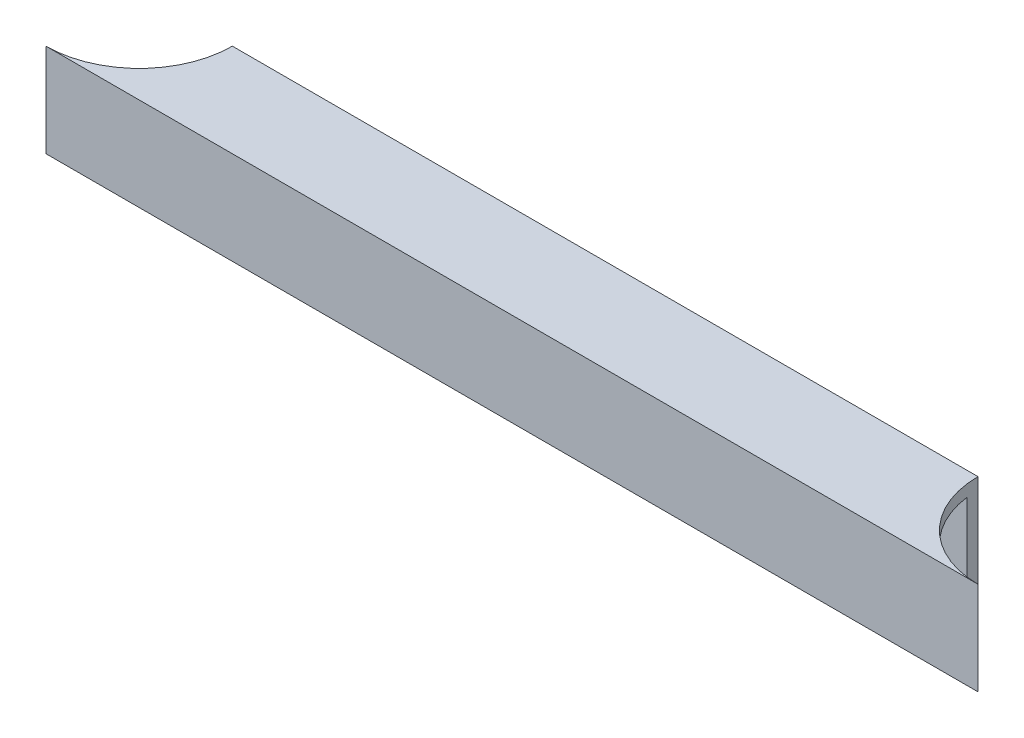
ISO-10303-21;
HEADER;
FILE_DESCRIPTION(('STEP AP214'),'2;1');
FILE_NAME('part.step','',(''),(''),'','','');
FILE_SCHEMA(('AUTOMOTIVE_DESIGN { 1 0 10303 214 1 1 1 1 }'));
ENDSEC;
DATA;
#1=APPLICATION_CONTEXT('core data for automotive mechanical design processes');
#2=APPLICATION_PROTOCOL_DEFINITION('international standard','automotive_design',2000,#1);
#3=PRODUCT_CONTEXT('',#1,'mechanical');
#4=PRODUCT('Part','Part','',(#3));
#5=PRODUCT_RELATED_PRODUCT_CATEGORY('part','',(#4));
#6=PRODUCT_DEFINITION_FORMATION('','',#4);
#7=PRODUCT_DEFINITION_CONTEXT('part definition',#1,'design');
#8=PRODUCT_DEFINITION('design','',#6,#7);
#9=PRODUCT_DEFINITION_SHAPE('','',#8);
#10=(LENGTH_UNIT() NAMED_UNIT(*) SI_UNIT(.MILLI.,.METRE.));
#11=(NAMED_UNIT(*) PLANE_ANGLE_UNIT() SI_UNIT($,.RADIAN.));
#12=(NAMED_UNIT(*) SI_UNIT($,.STERADIAN.) SOLID_ANGLE_UNIT());
#13=UNCERTAINTY_MEASURE_WITH_UNIT(LENGTH_MEASURE(1.E-05),#10,'distance_accuracy_value','');
#14=(GEOMETRIC_REPRESENTATION_CONTEXT(3) GLOBAL_UNCERTAINTY_ASSIGNED_CONTEXT((#13)) GLOBAL_UNIT_ASSIGNED_CONTEXT((#10,
#11,#12)) REPRESENTATION_CONTEXT('',''));
#15=CARTESIAN_POINT('',(0.,0.,0.));
#16=DIRECTION('',(0.,0.,1.));
#17=DIRECTION('',(1.,0.,0.));
#18=AXIS2_PLACEMENT_3D('',#15,#16,#17);
#19=CARTESIAN_POINT('',(0.,25.4,98.7234841870858));
#20=DIRECTION('',(0.,0.,-1.00000000000002));
#21=DIRECTION('',(-1.00000000000002,0.,0.));
#22=AXIS2_PLACEMENT_3D('',#19,#20,#21);
#23=PLANE('',#22);
#24=DIRECTION('',(1.00000000000002,0.,0.));
#25=VECTOR('',#24,1.);
#26=CARTESIAN_POINT('',(0.,0.,98.7234841870858));
#27=LINE('',#26,#25);
#28=CARTESIAN_POINT('',(-127.000000000004,0.,98.7234841870858));
#29=VERTEX_POINT('',#28);
#30=CARTESIAN_POINT('',(127.000000000003,0.,98.7234841870861));
#31=VERTEX_POINT('',#30);
#32=EDGE_CURVE('E136',#29,#31,#27,.T.);
#33=ORIENTED_EDGE('',*,*,#32,.T.);
#34=DIRECTION('',(0.,-1.,0.));
#35=VECTOR('',#34,1.);
#36=CARTESIAN_POINT('',(127.000000000003,25.4,98.7234841870861));
#37=LINE('',#36,#35);
#38=CARTESIAN_POINT('',(127.000000000003,25.4,98.7234841870861));
#39=VERTEX_POINT('',#38);
#40=EDGE_CURVE('E175',#39,#31,#37,.T.);
#41=ORIENTED_EDGE('',*,*,#40,.F.);
#42=DIRECTION('',(1.00000000000002,0.,0.));
#43=VECTOR('',#42,1.);
#44=CARTESIAN_POINT('',(0.,25.4,98.7234841870858));
#45=LINE('',#44,#43);
#46=CARTESIAN_POINT('',(-127.000000000004,25.4,98.7234841870858));
#47=VERTEX_POINT('',#46);
#48=EDGE_CURVE('E137',#47,#39,#45,.T.);
#49=ORIENTED_EDGE('',*,*,#48,.F.);
#50=DIRECTION('',(0.,-1.,0.));
#51=VECTOR('',#50,1.);
#52=CARTESIAN_POINT('',(-127.000000000004,25.4,98.7234841870858));
#53=LINE('',#52,#51);
#54=EDGE_CURVE('E152',#47,#29,#53,.T.);
#55=ORIENTED_EDGE('',*,*,#54,.T.);
#56=EDGE_LOOP('',(#33,#41,#49,#55));
#57=FACE_BOUND('',#56,.T.);
#58=ADVANCED_FACE('F42',(#57),#23,.F.);
#59=CARTESIAN_POINT('',(127.000000000003,25.4,73.323484187085));
#60=DIRECTION('',(0.,-1.,0.));
#61=DIRECTION('',(0.,0.,-1.00000000000002));
#62=AXIS2_PLACEMENT_3D('',#59,#60,#61);
#63=CYLINDRICAL_SURFACE('',#62,25.4);
#64=CARTESIAN_POINT('',(127.000000000003,3.17499999999998,73.323484187085));
#65=DIRECTION('',(0.,-1.,0.));
#66=DIRECTION('',(0.,0.,-1.00000000000002));
#67=AXIS2_PLACEMENT_3D('',#64,#65,#66);
#68=CIRCLE('',#67,25.4);
#69=CARTESIAN_POINT('',(101.799218762112,3.17499999999998,76.4984841870852));
#70=VERTEX_POINT('',#69);
#71=CARTESIAN_POINT('',(114.703277875794,3.17499999999998,95.5484841870858));
#72=VERTEX_POINT('',#71);
#73=EDGE_CURVE('E103',#70,#72,#68,.F.);
#74=ORIENTED_EDGE('',*,*,#73,.T.);
#75=DIRECTION('',(0.,-1.,0.));
#76=VECTOR('',#75,1.);
#77=CARTESIAN_POINT('',(114.703277875794,25.4,95.5484841870858));
#78=LINE('',#77,#76);
#79=CARTESIAN_POINT('',(114.703277875794,22.225,95.5484841870858));
#80=VERTEX_POINT('',#79);
#81=EDGE_CURVE('E130',#72,#80,#78,.F.);
#82=ORIENTED_EDGE('',*,*,#81,.T.);
#83=CARTESIAN_POINT('',(127.000000000003,22.225,73.323484187085));
#84=DIRECTION('',(0.,1.,0.));
#85=DIRECTION('',(0.,0.,1.00000000000002));
#86=AXIS2_PLACEMENT_3D('',#83,#84,#85);
#87=CIRCLE('',#86,25.4);
#88=CARTESIAN_POINT('',(101.799218762112,22.225,76.4984841870852));
#89=VERTEX_POINT('',#88);
#90=EDGE_CURVE('E125',#80,#89,#87,.F.);
#91=ORIENTED_EDGE('',*,*,#90,.T.);
#92=DIRECTION('',(0.,-1.,0.));
#93=VECTOR('',#92,1.);
#94=CARTESIAN_POINT('',(101.799218762112,25.4,76.4984841870852));
#95=LINE('',#94,#93);
#96=EDGE_CURVE('E109',#89,#70,#95,.T.);
#97=ORIENTED_EDGE('',*,*,#96,.T.);
#98=EDGE_LOOP('',(#74,#82,#91,#97));
#99=FACE_BOUND('',#98,.T.);
#100=CARTESIAN_POINT('',(127.000000000003,0.,73.323484187085));
#101=DIRECTION('',(0.,1.,0.));
#102=DIRECTION('',(0.,0.,1.00000000000002));
#103=AXIS2_PLACEMENT_3D('',#100,#101,#102);
#104=CIRCLE('',#103,25.4);
#105=CARTESIAN_POINT('',(101.600000000003,0.,73.3234841870851));
#106=VERTEX_POINT('',#105);
#107=EDGE_CURVE('E156',#31,#106,#104,.F.);
#108=ORIENTED_EDGE('',*,*,#107,.T.);
#109=DIRECTION('',(0.,-1.,0.));
#110=VECTOR('',#109,1.);
#111=CARTESIAN_POINT('',(101.600000000003,25.4,73.3234841870851));
#112=LINE('',#111,#110);
#113=CARTESIAN_POINT('',(101.600000000003,25.4,73.3234841870851));
#114=VERTEX_POINT('',#113);
#115=EDGE_CURVE('E171',#114,#106,#112,.T.);
#116=ORIENTED_EDGE('',*,*,#115,.F.);
#117=CARTESIAN_POINT('',(127.000000000003,25.4,73.323484187085));
#118=DIRECTION('',(0.,1.,0.));
#119=DIRECTION('',(0.,0.,1.00000000000002));
#120=AXIS2_PLACEMENT_3D('',#117,#118,#119);
#121=CIRCLE('',#120,25.4);
#122=EDGE_CURVE('E141',#39,#114,#121,.F.);
#123=ORIENTED_EDGE('',*,*,#122,.F.);
#124=ORIENTED_EDGE('',*,*,#40,.T.);
#125=EDGE_LOOP('',(#108,#116,#123,#124));
#126=FACE_BOUND('',#125,.T.);
#127=ADVANCED_FACE('F123',(#99,#126),#63,.F.);
#128=CARTESIAN_POINT('',(0.,25.4,73.3234841870848));
#129=DIRECTION('',(0.,0.,1.00000000000003));
#130=DIRECTION('',(1.00000000000003,0.,0.));
#131=AXIS2_PLACEMENT_3D('',#128,#129,#130);
#132=PLANE('',#131);
#133=DIRECTION('',(-1.00000000000003,0.,0.));
#134=VECTOR('',#133,1.);
#135=CARTESIAN_POINT('',(0.,0.,73.3234841870848));
#136=LINE('',#135,#134);
#137=CARTESIAN_POINT('',(-101.600000000003,0.,73.3234841870848));
#138=VERTEX_POINT('',#137);
#139=EDGE_CURVE('E159',#106,#138,#136,.T.);
#140=ORIENTED_EDGE('',*,*,#139,.T.);
#141=DIRECTION('',(0.,-1.,0.));
#142=VECTOR('',#141,1.);
#143=CARTESIAN_POINT('',(-101.600000000003,25.4,73.3234841870848));
#144=LINE('',#143,#142);
#145=CARTESIAN_POINT('',(-101.600000000003,25.4,73.3234841870848));
#146=VERTEX_POINT('',#145);
#147=EDGE_CURVE('E168',#146,#138,#144,.T.);
#148=ORIENTED_EDGE('',*,*,#147,.F.);
#149=DIRECTION('',(-1.00000000000003,0.,0.));
#150=VECTOR('',#149,1.);
#151=CARTESIAN_POINT('',(0.,25.4,73.3234841870848));
#152=LINE('',#151,#150);
#153=EDGE_CURVE('E145',#114,#146,#152,.T.);
#154=ORIENTED_EDGE('',*,*,#153,.F.);
#155=ORIENTED_EDGE('',*,*,#115,.T.);
#156=EDGE_LOOP('',(#140,#148,#154,#155));
#157=FACE_BOUND('',#156,.T.);
#158=ADVANCED_FACE('F224',(#157),#132,.F.);
#159=CARTESIAN_POINT('',(-127.000000000003,25.4,73.3234841870851));
#160=DIRECTION('',(0.,-1.,0.));
#161=DIRECTION('',(0.,0.,-1.00000000000002));
#162=AXIS2_PLACEMENT_3D('',#159,#160,#161);
#163=CYLINDRICAL_SURFACE('',#162,25.4);
#164=DIRECTION('',(0.,-1.,0.));
#165=VECTOR('',#164,1.);
#166=CARTESIAN_POINT('',(-114.703277875795,25.4,95.5484841870862));
#167=LINE('',#166,#165);
#168=CARTESIAN_POINT('',(-114.703277875795,3.17499999999998,95.5484841870862));
#169=VERTEX_POINT('',#168);
#170=CARTESIAN_POINT('',(-114.703277875795,22.225,95.5484841870862));
#171=VERTEX_POINT('',#170);
#172=EDGE_CURVE('E11',#169,#171,#167,.F.);
#173=ORIENTED_EDGE('',*,*,#172,.F.);
#174=CARTESIAN_POINT('',(-127.000000000003,3.17499999999998,73.3234841870851));
#175=DIRECTION('',(0.,-1.,0.));
#176=DIRECTION('',(0.,0.,-1.00000000000002));
#177=AXIS2_PLACEMENT_3D('',#174,#175,#176);
#178=CIRCLE('',#177,25.4);
#179=CARTESIAN_POINT('',(-101.799218762113,3.17499999999998,76.4984841870849));
#180=VERTEX_POINT('',#179);
#181=EDGE_CURVE('E179',#180,#169,#178,.T.);
#182=ORIENTED_EDGE('',*,*,#181,.F.);
#183=DIRECTION('',(0.,-1.,0.));
#184=VECTOR('',#183,1.);
#185=CARTESIAN_POINT('',(-101.799218762113,25.4,76.4984841870849));
#186=LINE('',#185,#184);
#187=CARTESIAN_POINT('',(-101.799218762113,22.225,76.4984841870849));
#188=VERTEX_POINT('',#187);
#189=EDGE_CURVE('E117',#188,#180,#186,.T.);
#190=ORIENTED_EDGE('',*,*,#189,.F.);
#191=CARTESIAN_POINT('',(-127.000000000003,22.225,73.3234841870851));
#192=DIRECTION('',(0.,1.,0.));
#193=DIRECTION('',(0.,0.,1.00000000000002));
#194=AXIS2_PLACEMENT_3D('',#191,#192,#193);
#195=CIRCLE('',#194,25.4);
#196=EDGE_CURVE('E50',#171,#188,#195,.T.);
#197=ORIENTED_EDGE('',*,*,#196,.F.);
#198=EDGE_LOOP('',(#173,#182,#190,#197));
#199=FACE_BOUND('',#198,.T.);
#200=CARTESIAN_POINT('',(-127.000000000003,0.,73.3234841870851));
#201=DIRECTION('',(0.,1.,0.));
#202=DIRECTION('',(0.,0.,1.00000000000002));
#203=AXIS2_PLACEMENT_3D('',#200,#201,#202);
#204=CIRCLE('',#203,25.4);
#205=EDGE_CURVE('E142',#29,#138,#204,.T.);
#206=ORIENTED_EDGE('',*,*,#205,.F.);
#207=ORIENTED_EDGE('',*,*,#54,.F.);
#208=CARTESIAN_POINT('',(-127.000000000003,25.4,73.3234841870851));
#209=DIRECTION('',(0.,1.,0.));
#210=DIRECTION('',(0.,0.,1.00000000000002));
#211=AXIS2_PLACEMENT_3D('',#208,#209,#210);
#212=CIRCLE('',#211,25.4);
#213=EDGE_CURVE('E148',#47,#146,#212,.T.);
#214=ORIENTED_EDGE('',*,*,#213,.T.);
#215=ORIENTED_EDGE('',*,*,#147,.T.);
#216=EDGE_LOOP('',(#206,#207,#214,#215));
#217=FACE_BOUND('',#216,.T.);
#218=ADVANCED_FACE('F194',(#199,#217),#163,.F.);
#219=CARTESIAN_POINT('',(0.,25.4,0.));
#220=DIRECTION('',(0.,1.,0.));
#221=DIRECTION('',(0.,0.,1.00000000000002));
#222=AXIS2_PLACEMENT_3D('',#219,#220,#221);
#223=PLANE('',#222);
#224=ORIENTED_EDGE('',*,*,#48,.T.);
#225=ORIENTED_EDGE('',*,*,#122,.T.);
#226=ORIENTED_EDGE('',*,*,#153,.T.);
#227=ORIENTED_EDGE('',*,*,#213,.F.);
#228=EDGE_LOOP('',(#224,#225,#226,#227));
#229=FACE_BOUND('',#228,.T.);
#230=ADVANCED_FACE('F214',(#229),#223,.T.);
#231=CARTESIAN_POINT('',(0.,0.,0.));
#232=DIRECTION('',(0.,1.,0.));
#233=DIRECTION('',(0.,0.,1.00000000000002));
#234=AXIS2_PLACEMENT_3D('',#231,#232,#233);
#235=PLANE('',#234);
#236=ORIENTED_EDGE('',*,*,#32,.F.);
#237=ORIENTED_EDGE('',*,*,#205,.T.);
#238=ORIENTED_EDGE('',*,*,#139,.F.);
#239=ORIENTED_EDGE('',*,*,#107,.F.);
#240=EDGE_LOOP('',(#236,#237,#238,#239));
#241=FACE_BOUND('',#240,.T.);
#242=ADVANCED_FACE('F207',(#241),#235,.F.);
#243=CARTESIAN_POINT('',(-127.000000000004,22.225,95.548484187086));
#244=DIRECTION('',(0.,0.,1.00000000000002));
#245=DIRECTION('',(1.00000000000002,0.,0.));
#246=AXIS2_PLACEMENT_3D('',#243,#244,#245);
#247=PLANE('',#246);
#248=DIRECTION('',(1.00000000000002,0.,0.));
#249=VECTOR('',#248,1.);
#250=CARTESIAN_POINT('',(-127.000000000004,3.17499999999998,95.548484187086));
#251=LINE('',#250,#249);
#252=EDGE_CURVE('E57',#169,#72,#251,.T.);
#253=ORIENTED_EDGE('',*,*,#252,.F.);
#254=ORIENTED_EDGE('',*,*,#172,.T.);
#255=DIRECTION('',(1.00000000000002,0.,0.));
#256=VECTOR('',#255,1.);
#257=CARTESIAN_POINT('',(-127.000000000004,22.225,95.548484187086));
#258=LINE('',#257,#256);
#259=EDGE_CURVE('E110',#171,#80,#258,.T.);
#260=ORIENTED_EDGE('',*,*,#259,.T.);
#261=ORIENTED_EDGE('',*,*,#81,.F.);
#262=EDGE_LOOP('',(#253,#254,#260,#261));
#263=FACE_BOUND('',#262,.T.);
#264=ADVANCED_FACE('F197',(#263),#247,.F.);
#265=CARTESIAN_POINT('',(-127.000000000004,22.225,95.548484187086));
#266=DIRECTION('',(0.,1.,0.));
#267=DIRECTION('',(0.,0.,1.00000000000002));
#268=AXIS2_PLACEMENT_3D('',#265,#266,#267);
#269=PLANE('',#268);
#270=ORIENTED_EDGE('',*,*,#259,.F.);
#271=ORIENTED_EDGE('',*,*,#196,.T.);
#272=DIRECTION('',(1.00000000000002,0.,0.));
#273=VECTOR('',#272,1.);
#274=CARTESIAN_POINT('',(-127.000000000003,22.225,76.4984841870857));
#275=LINE('',#274,#273);
#276=EDGE_CURVE('E120',#188,#89,#275,.T.);
#277=ORIENTED_EDGE('',*,*,#276,.T.);
#278=ORIENTED_EDGE('',*,*,#90,.F.);
#279=EDGE_LOOP('',(#270,#271,#277,#278));
#280=FACE_BOUND('',#279,.T.);
#281=ADVANCED_FACE('F188',(#280),#269,.F.);
#282=CARTESIAN_POINT('',(-127.000000000003,22.225,76.4984841870857));
#283=DIRECTION('',(0.,0.,-1.00000000000002));
#284=DIRECTION('',(-1.00000000000002,0.,0.));
#285=AXIS2_PLACEMENT_3D('',#282,#283,#284);
#286=PLANE('',#285);
#287=ORIENTED_EDGE('',*,*,#276,.F.);
#288=ORIENTED_EDGE('',*,*,#189,.T.);
#289=DIRECTION('',(1.00000000000002,0.,0.));
#290=VECTOR('',#289,1.);
#291=CARTESIAN_POINT('',(-127.000000000003,3.17499999999998,76.4984841870857));
#292=LINE('',#291,#290);
#293=EDGE_CURVE('E62',#180,#70,#292,.T.);
#294=ORIENTED_EDGE('',*,*,#293,.T.);
#295=ORIENTED_EDGE('',*,*,#96,.F.);
#296=EDGE_LOOP('',(#287,#288,#294,#295));
#297=FACE_BOUND('',#296,.T.);
#298=ADVANCED_FACE('F114',(#297),#286,.F.);
#299=CARTESIAN_POINT('',(-127.000000000004,3.17499999999998,95.548484187086));
#300=DIRECTION('',(0.,-1.,0.));
#301=DIRECTION('',(0.,0.,-1.00000000000002));
#302=AXIS2_PLACEMENT_3D('',#299,#300,#301);
#303=PLANE('',#302);
#304=ORIENTED_EDGE('',*,*,#293,.F.);
#305=ORIENTED_EDGE('',*,*,#181,.T.);
#306=ORIENTED_EDGE('',*,*,#252,.T.);
#307=ORIENTED_EDGE('',*,*,#73,.F.);
#308=EDGE_LOOP('',(#304,#305,#306,#307));
#309=FACE_BOUND('',#308,.T.);
#310=ADVANCED_FACE('F104',(#309),#303,.F.);
#311=CLOSED_SHELL('',(#58,#127,#158,#218,#230,#242,#264,#281,#298,#310));
#312=MANIFOLD_SOLID_BREP('B2',#311);
#313=ADVANCED_BREP_SHAPE_REPRESENTATION('',(#18,#312),#14);
#314=SHAPE_DEFINITION_REPRESENTATION(#9,#313);
ENDSEC;
END-ISO-10303-21;
